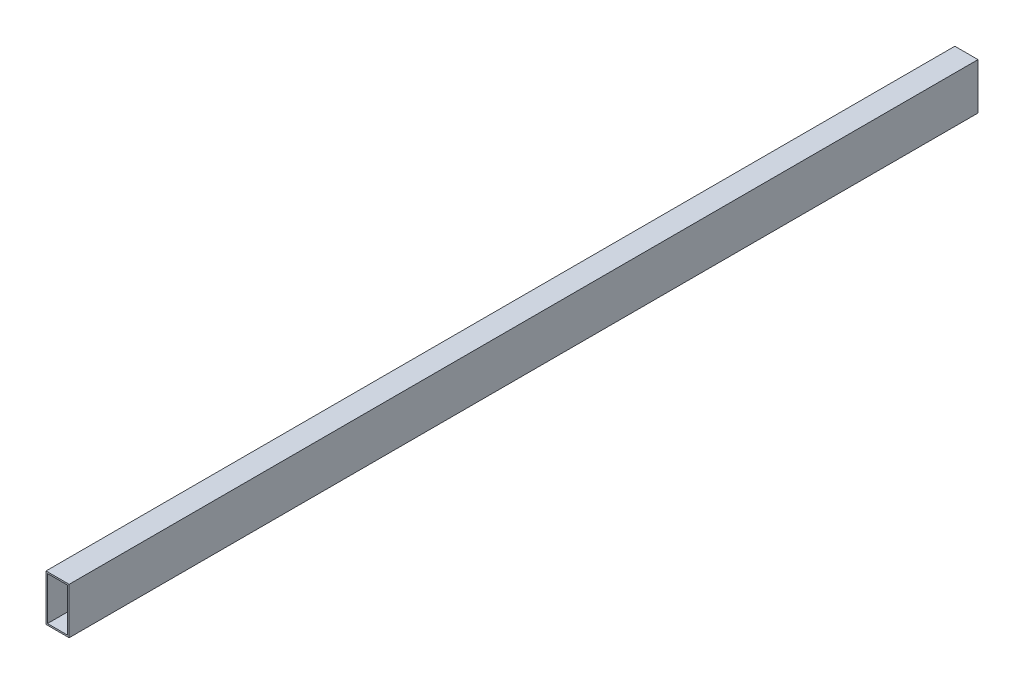
ISO-10303-21;
HEADER;
FILE_DESCRIPTION(('STEP AP214'),'2;1');
FILE_NAME('part.step','',(''),(''),'','','');
FILE_SCHEMA(('AUTOMOTIVE_DESIGN { 1 0 10303 214 1 1 1 1 }'));
ENDSEC;
DATA;
#1=APPLICATION_CONTEXT('core data for automotive mechanical design processes');
#2=APPLICATION_PROTOCOL_DEFINITION('international standard','automotive_design',2000,#1);
#3=PRODUCT_CONTEXT('',#1,'mechanical');
#4=PRODUCT('Part','Part','',(#3));
#5=PRODUCT_RELATED_PRODUCT_CATEGORY('part','',(#4));
#6=PRODUCT_DEFINITION_FORMATION('','',#4);
#7=PRODUCT_DEFINITION_CONTEXT('part definition',#1,'design');
#8=PRODUCT_DEFINITION('design','',#6,#7);
#9=PRODUCT_DEFINITION_SHAPE('','',#8);
#10=(LENGTH_UNIT() NAMED_UNIT(*) SI_UNIT(.MILLI.,.METRE.));
#11=(NAMED_UNIT(*) PLANE_ANGLE_UNIT() SI_UNIT($,.RADIAN.));
#12=(NAMED_UNIT(*) SI_UNIT($,.STERADIAN.) SOLID_ANGLE_UNIT());
#13=UNCERTAINTY_MEASURE_WITH_UNIT(LENGTH_MEASURE(1.E-05),#10,'distance_accuracy_value','');
#14=(GEOMETRIC_REPRESENTATION_CONTEXT(3) GLOBAL_UNCERTAINTY_ASSIGNED_CONTEXT((#13)) GLOBAL_UNIT_ASSIGNED_CONTEXT((#10,
#11,#12)) REPRESENTATION_CONTEXT('',''));
#15=CARTESIAN_POINT('',(0.,0.,0.));
#16=DIRECTION('',(0.,0.,1.));
#17=DIRECTION('',(1.,0.,0.));
#18=AXIS2_PLACEMENT_3D('',#15,#16,#17);
#19=CARTESIAN_POINT('',(-48.4372093023255,-30.1994186046511,996.95));
#20=DIRECTION('',(1.,0.,0.));
#21=DIRECTION('',(0.,0.,-1.));
#22=AXIS2_PLACEMENT_3D('',#19,#20,#21);
#23=PLANE('',#22);
#24=DIRECTION('',(0.,-1.,0.));
#25=VECTOR('',#24,1.);
#26=CARTESIAN_POINT('',(-48.4372093023255,-30.1994186046511,0.));
#27=LINE('',#26,#25);
#28=CARTESIAN_POINT('',(-48.4372093023255,20.6005813953489,0.));
#29=VERTEX_POINT('',#28);
#30=CARTESIAN_POINT('',(-48.4372093023255,-30.1994186046511,0.));
#31=VERTEX_POINT('',#30);
#32=EDGE_CURVE('E129',#29,#31,#27,.T.);
#33=ORIENTED_EDGE('',*,*,#32,.T.);
#34=DIRECTION('',(0.,0.,-1.));
#35=VECTOR('',#34,1.);
#36=CARTESIAN_POINT('',(-48.4372093023255,-30.1994186046511,996.95));
#37=LINE('',#36,#35);
#38=CARTESIAN_POINT('',(-48.4372093023255,-30.1994186046511,996.95));
#39=VERTEX_POINT('',#38);
#40=EDGE_CURVE('E11',#39,#31,#37,.T.);
#41=ORIENTED_EDGE('',*,*,#40,.F.);
#42=DIRECTION('',(0.,-1.,0.));
#43=VECTOR('',#42,1.);
#44=CARTESIAN_POINT('',(-48.4372093023255,-30.1994186046511,996.95));
#45=LINE('',#44,#43);
#46=CARTESIAN_POINT('',(-48.4372093023255,20.6005813953489,996.95));
#47=VERTEX_POINT('',#46);
#48=EDGE_CURVE('E133',#47,#39,#45,.T.);
#49=ORIENTED_EDGE('',*,*,#48,.F.);
#50=DIRECTION('',(0.,0.,-1.));
#51=VECTOR('',#50,1.);
#52=CARTESIAN_POINT('',(-48.4372093023255,20.6005813953489,996.95));
#53=LINE('',#52,#51);
#54=EDGE_CURVE('E143',#47,#29,#53,.T.);
#55=ORIENTED_EDGE('',*,*,#54,.T.);
#56=EDGE_LOOP('',(#33,#41,#49,#55));
#57=FACE_BOUND('',#56,.T.);
#58=ADVANCED_FACE('F32',(#57),#23,.F.);
#59=CARTESIAN_POINT('',(-48.4372093023255,-30.1994186046511,996.95));
#60=DIRECTION('',(0.,1.,0.));
#61=DIRECTION('',(0.,0.,1.));
#62=AXIS2_PLACEMENT_3D('',#59,#60,#61);
#63=PLANE('',#62);
#64=DIRECTION('',(1.,0.,0.));
#65=VECTOR('',#64,1.);
#66=CARTESIAN_POINT('',(-48.4372093023255,-30.1994186046511,0.));
#67=LINE('',#66,#65);
#68=CARTESIAN_POINT('',(-23.0372093023255,-30.1994186046511,0.));
#69=VERTEX_POINT('',#68);
#70=EDGE_CURVE('E146',#31,#69,#67,.T.);
#71=ORIENTED_EDGE('',*,*,#70,.T.);
#72=DIRECTION('',(0.,0.,-1.));
#73=VECTOR('',#72,1.);
#74=CARTESIAN_POINT('',(-23.0372093023255,-30.1994186046511,996.95));
#75=LINE('',#74,#73);
#76=CARTESIAN_POINT('',(-23.0372093023255,-30.1994186046511,996.95));
#77=VERTEX_POINT('',#76);
#78=EDGE_CURVE('E39',#77,#69,#75,.T.);
#79=ORIENTED_EDGE('',*,*,#78,.F.);
#80=DIRECTION('',(1.,0.,0.));
#81=VECTOR('',#80,1.);
#82=CARTESIAN_POINT('',(-48.4372093023255,-30.1994186046511,996.95));
#83=LINE('',#82,#81);
#84=EDGE_CURVE('E136',#39,#77,#83,.T.);
#85=ORIENTED_EDGE('',*,*,#84,.F.);
#86=ORIENTED_EDGE('',*,*,#40,.T.);
#87=EDGE_LOOP('',(#71,#79,#85,#86));
#88=FACE_BOUND('',#87,.T.);
#89=ADVANCED_FACE('F174',(#88),#63,.F.);
#90=CARTESIAN_POINT('',(-23.0372093023255,-30.1994186046511,996.95));
#91=DIRECTION('',(-1.,0.,0.));
#92=DIRECTION('',(0.,-1.,0.));
#93=AXIS2_PLACEMENT_3D('',#90,#91,#92);
#94=PLANE('',#93);
#95=DIRECTION('',(0.,1.,0.));
#96=VECTOR('',#95,1.);
#97=CARTESIAN_POINT('',(-23.0372093023255,-30.1994186046511,0.));
#98=LINE('',#97,#96);
#99=CARTESIAN_POINT('',(-23.0372093023255,20.6005813953489,0.));
#100=VERTEX_POINT('',#99);
#101=EDGE_CURVE('E148',#69,#100,#98,.T.);
#102=ORIENTED_EDGE('',*,*,#101,.T.);
#103=DIRECTION('',(0.,0.,-1.));
#104=VECTOR('',#103,1.);
#105=CARTESIAN_POINT('',(-23.0372093023255,20.6005813953489,996.95));
#106=LINE('',#105,#104);
#107=CARTESIAN_POINT('',(-23.0372093023255,20.6005813953489,996.95));
#108=VERTEX_POINT('',#107);
#109=EDGE_CURVE('E153',#108,#100,#106,.T.);
#110=ORIENTED_EDGE('',*,*,#109,.F.);
#111=DIRECTION('',(0.,1.,0.));
#112=VECTOR('',#111,1.);
#113=CARTESIAN_POINT('',(-23.0372093023255,-30.1994186046511,996.95));
#114=LINE('',#113,#112);
#115=EDGE_CURVE('E139',#77,#108,#114,.T.);
#116=ORIENTED_EDGE('',*,*,#115,.F.);
#117=ORIENTED_EDGE('',*,*,#78,.T.);
#118=EDGE_LOOP('',(#102,#110,#116,#117));
#119=FACE_BOUND('',#118,.T.);
#120=ADVANCED_FACE('F160',(#119),#94,.F.);
#121=CARTESIAN_POINT('',(-48.4372093023255,20.6005813953489,996.95));
#122=DIRECTION('',(0.,-1.,0.));
#123=DIRECTION('',(0.,0.,-1.));
#124=AXIS2_PLACEMENT_3D('',#121,#122,#123);
#125=PLANE('',#124);
#126=DIRECTION('',(-1.,0.,0.));
#127=VECTOR('',#126,1.);
#128=CARTESIAN_POINT('',(-48.4372093023255,20.6005813953489,0.));
#129=LINE('',#128,#127);
#130=EDGE_CURVE('E137',#100,#29,#129,.T.);
#131=ORIENTED_EDGE('',*,*,#130,.T.);
#132=ORIENTED_EDGE('',*,*,#54,.F.);
#133=DIRECTION('',(-1.,0.,0.));
#134=VECTOR('',#133,1.);
#135=CARTESIAN_POINT('',(-48.4372093023255,20.6005813953489,996.95));
#136=LINE('',#135,#134);
#137=EDGE_CURVE('E141',#108,#47,#136,.T.);
#138=ORIENTED_EDGE('',*,*,#137,.F.);
#139=ORIENTED_EDGE('',*,*,#109,.T.);
#140=EDGE_LOOP('',(#131,#132,#138,#139));
#141=FACE_BOUND('',#140,.T.);
#142=ADVANCED_FACE('F167',(#141),#125,.F.);
#143=CARTESIAN_POINT('',(0.,0.,996.95));
#144=DIRECTION('',(0.,0.,-1.));
#145=DIRECTION('',(-1.,0.,0.));
#146=AXIS2_PLACEMENT_3D('',#143,#144,#145);
#147=PLANE('',#146);
#148=DIRECTION('',(-1.,0.,0.));
#149=VECTOR('',#148,1.);
#150=CARTESIAN_POINT('',(-46.7862093023255,18.9495813953489,996.95));
#151=LINE('',#150,#149);
#152=CARTESIAN_POINT('',(-24.6882093023255,18.9495813953489,996.95));
#153=VERTEX_POINT('',#152);
#154=CARTESIAN_POINT('',(-46.7862093023255,18.9495813953489,996.95));
#155=VERTEX_POINT('',#154);
#156=EDGE_CURVE('E123',#153,#155,#151,.T.);
#157=ORIENTED_EDGE('',*,*,#156,.F.);
#158=DIRECTION('',(0.,1.,0.));
#159=VECTOR('',#158,1.);
#160=CARTESIAN_POINT('',(-24.6882093023255,18.9495813953489,996.95));
#161=LINE('',#160,#159);
#162=CARTESIAN_POINT('',(-24.6882093023255,-28.5484186046511,996.95));
#163=VERTEX_POINT('',#162);
#164=EDGE_CURVE('E46',#163,#153,#161,.T.);
#165=ORIENTED_EDGE('',*,*,#164,.F.);
#166=DIRECTION('',(1.,0.,0.));
#167=VECTOR('',#166,1.);
#168=CARTESIAN_POINT('',(-46.7862093023255,-28.5484186046511,996.95));
#169=LINE('',#168,#167);
#170=CARTESIAN_POINT('',(-46.7862093023255,-28.5484186046511,996.95));
#171=VERTEX_POINT('',#170);
#172=EDGE_CURVE('E114',#171,#163,#169,.T.);
#173=ORIENTED_EDGE('',*,*,#172,.F.);
#174=DIRECTION('',(0.,-1.,0.));
#175=VECTOR('',#174,1.);
#176=CARTESIAN_POINT('',(-46.7862093023255,18.9495813953489,996.95));
#177=LINE('',#176,#175);
#178=EDGE_CURVE('E117',#155,#171,#177,.T.);
#179=ORIENTED_EDGE('',*,*,#178,.F.);
#180=EDGE_LOOP('',(#157,#165,#173,#179));
#181=FACE_BOUND('',#180,.T.);
#182=ORIENTED_EDGE('',*,*,#48,.T.);
#183=ORIENTED_EDGE('',*,*,#84,.T.);
#184=ORIENTED_EDGE('',*,*,#115,.T.);
#185=ORIENTED_EDGE('',*,*,#137,.T.);
#186=EDGE_LOOP('',(#182,#183,#184,#185));
#187=FACE_BOUND('',#186,.T.);
#188=ADVANCED_FACE('F173',(#181,#187),#147,.F.);
#189=CARTESIAN_POINT('',(0.,0.,0.));
#190=DIRECTION('',(0.,0.,-1.));
#191=DIRECTION('',(-1.,0.,0.));
#192=AXIS2_PLACEMENT_3D('',#189,#190,#191);
#193=PLANE('',#192);
#194=DIRECTION('',(0.,1.,0.));
#195=VECTOR('',#194,1.);
#196=CARTESIAN_POINT('',(-24.6882093023255,18.9495813953489,0.));
#197=LINE('',#196,#195);
#198=CARTESIAN_POINT('',(-24.6882093023255,-28.5484186046511,0.));
#199=VERTEX_POINT('',#198);
#200=CARTESIAN_POINT('',(-24.6882093023255,18.9495813953489,0.));
#201=VERTEX_POINT('',#200);
#202=EDGE_CURVE('E98',#199,#201,#197,.T.);
#203=ORIENTED_EDGE('',*,*,#202,.T.);
#204=DIRECTION('',(-1.,0.,0.));
#205=VECTOR('',#204,1.);
#206=CARTESIAN_POINT('',(-46.7862093023255,18.9495813953489,0.));
#207=LINE('',#206,#205);
#208=CARTESIAN_POINT('',(-46.7862093023255,18.9495813953489,0.));
#209=VERTEX_POINT('',#208);
#210=EDGE_CURVE('E107',#201,#209,#207,.T.);
#211=ORIENTED_EDGE('',*,*,#210,.T.);
#212=DIRECTION('',(0.,-1.,0.));
#213=VECTOR('',#212,1.);
#214=CARTESIAN_POINT('',(-46.7862093023255,18.9495813953489,0.));
#215=LINE('',#214,#213);
#216=CARTESIAN_POINT('',(-46.7862093023255,-28.5484186046511,0.));
#217=VERTEX_POINT('',#216);
#218=EDGE_CURVE('E54',#209,#217,#215,.T.);
#219=ORIENTED_EDGE('',*,*,#218,.T.);
#220=DIRECTION('',(1.,0.,0.));
#221=VECTOR('',#220,1.);
#222=CARTESIAN_POINT('',(-46.7862093023255,-28.5484186046511,0.));
#223=LINE('',#222,#221);
#224=EDGE_CURVE('E104',#217,#199,#223,.T.);
#225=ORIENTED_EDGE('',*,*,#224,.T.);
#226=EDGE_LOOP('',(#203,#211,#219,#225));
#227=FACE_BOUND('',#226,.T.);
#228=ORIENTED_EDGE('',*,*,#32,.F.);
#229=ORIENTED_EDGE('',*,*,#130,.F.);
#230=ORIENTED_EDGE('',*,*,#101,.F.);
#231=ORIENTED_EDGE('',*,*,#70,.F.);
#232=EDGE_LOOP('',(#228,#229,#230,#231));
#233=FACE_BOUND('',#232,.T.);
#234=ADVANCED_FACE('F111',(#227,#233),#193,.T.);
#235=CARTESIAN_POINT('',(-24.6882093023255,18.9495813953489,0.));
#236=DIRECTION('',(1.,0.,0.));
#237=DIRECTION('',(0.,1.,0.));
#238=AXIS2_PLACEMENT_3D('',#235,#236,#237);
#239=PLANE('',#238);
#240=ORIENTED_EDGE('',*,*,#164,.T.);
#241=DIRECTION('',(0.,0.,1.));
#242=VECTOR('',#241,1.);
#243=CARTESIAN_POINT('',(-24.6882093023255,18.9495813953489,0.));
#244=LINE('',#243,#242);
#245=EDGE_CURVE('E94',#201,#153,#244,.T.);
#246=ORIENTED_EDGE('',*,*,#245,.F.);
#247=ORIENTED_EDGE('',*,*,#202,.F.);
#248=DIRECTION('',(0.,0.,1.));
#249=VECTOR('',#248,1.);
#250=CARTESIAN_POINT('',(-24.6882093023255,-28.5484186046511,0.));
#251=LINE('',#250,#249);
#252=EDGE_CURVE('E127',#199,#163,#251,.T.);
#253=ORIENTED_EDGE('',*,*,#252,.T.);
#254=EDGE_LOOP('',(#240,#246,#247,#253));
#255=FACE_BOUND('',#254,.T.);
#256=ADVANCED_FACE('F96',(#255),#239,.F.);
#257=CARTESIAN_POINT('',(-46.7862093023255,-28.5484186046511,0.));
#258=DIRECTION('',(0.,-1.,0.));
#259=DIRECTION('',(0.,0.,-1.));
#260=AXIS2_PLACEMENT_3D('',#257,#258,#259);
#261=PLANE('',#260);
#262=ORIENTED_EDGE('',*,*,#172,.T.);
#263=ORIENTED_EDGE('',*,*,#252,.F.);
#264=ORIENTED_EDGE('',*,*,#224,.F.);
#265=DIRECTION('',(0.,0.,1.));
#266=VECTOR('',#265,1.);
#267=CARTESIAN_POINT('',(-46.7862093023255,-28.5484186046511,0.));
#268=LINE('',#267,#266);
#269=EDGE_CURVE('E130',#217,#171,#268,.T.);
#270=ORIENTED_EDGE('',*,*,#269,.T.);
#271=EDGE_LOOP('',(#262,#263,#264,#270));
#272=FACE_BOUND('',#271,.T.);
#273=ADVANCED_FACE('F191',(#272),#261,.F.);
#274=CARTESIAN_POINT('',(-46.7862093023255,18.9495813953489,0.));
#275=DIRECTION('',(-1.,0.,0.));
#276=DIRECTION('',(0.,-1.,0.));
#277=AXIS2_PLACEMENT_3D('',#274,#275,#276);
#278=PLANE('',#277);
#279=ORIENTED_EDGE('',*,*,#178,.T.);
#280=ORIENTED_EDGE('',*,*,#269,.F.);
#281=ORIENTED_EDGE('',*,*,#218,.F.);
#282=DIRECTION('',(0.,0.,1.));
#283=VECTOR('',#282,1.);
#284=CARTESIAN_POINT('',(-46.7862093023255,18.9495813953489,0.));
#285=LINE('',#284,#283);
#286=EDGE_CURVE('E103',#209,#155,#285,.T.);
#287=ORIENTED_EDGE('',*,*,#286,.T.);
#288=EDGE_LOOP('',(#279,#280,#281,#287));
#289=FACE_BOUND('',#288,.T.);
#290=ADVANCED_FACE('F194',(#289),#278,.F.);
#291=CARTESIAN_POINT('',(-46.7862093023255,18.9495813953489,0.));
#292=DIRECTION('',(0.,1.,0.));
#293=DIRECTION('',(0.,0.,1.));
#294=AXIS2_PLACEMENT_3D('',#291,#292,#293);
#295=PLANE('',#294);
#296=ORIENTED_EDGE('',*,*,#156,.T.);
#297=ORIENTED_EDGE('',*,*,#286,.F.);
#298=ORIENTED_EDGE('',*,*,#210,.F.);
#299=ORIENTED_EDGE('',*,*,#245,.T.);
#300=EDGE_LOOP('',(#296,#297,#298,#299));
#301=FACE_BOUND('',#300,.T.);
#302=ADVANCED_FACE('F108',(#301),#295,.F.);
#303=CLOSED_SHELL('',(#58,#89,#120,#142,#188,#234,#256,#273,#290,#302));
#304=MANIFOLD_SOLID_BREP('B2',#303);
#305=ADVANCED_BREP_SHAPE_REPRESENTATION('',(#18,#304),#14);
#306=SHAPE_DEFINITION_REPRESENTATION(#9,#305);
ENDSEC;
END-ISO-10303-21;
